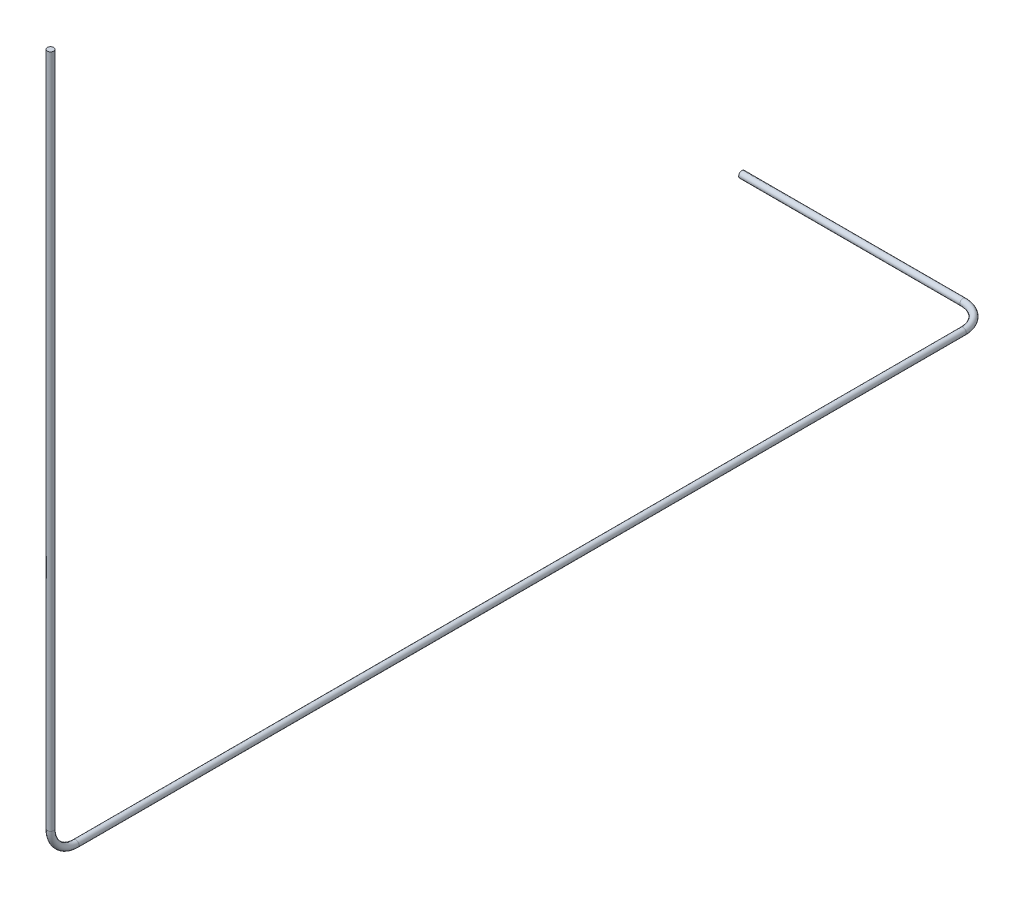
ISO-10303-21;
HEADER;
FILE_DESCRIPTION(('STEP AP214'),'2;1');
FILE_NAME('part.step','',(''),(''),'','','');
FILE_SCHEMA(('AUTOMOTIVE_DESIGN { 1 0 10303 214 1 1 1 1 }'));
ENDSEC;
DATA;
#1=APPLICATION_CONTEXT('core data for automotive mechanical design processes');
#2=APPLICATION_PROTOCOL_DEFINITION('international standard','automotive_design',2000,#1);
#3=PRODUCT_CONTEXT('',#1,'mechanical');
#4=PRODUCT('Part','Part','',(#3));
#5=PRODUCT_RELATED_PRODUCT_CATEGORY('part','',(#4));
#6=PRODUCT_DEFINITION_FORMATION('','',#4);
#7=PRODUCT_DEFINITION_CONTEXT('part definition',#1,'design');
#8=PRODUCT_DEFINITION('design','',#6,#7);
#9=PRODUCT_DEFINITION_SHAPE('','',#8);
#10=(LENGTH_UNIT() NAMED_UNIT(*) SI_UNIT(.MILLI.,.METRE.));
#11=(NAMED_UNIT(*) PLANE_ANGLE_UNIT() SI_UNIT($,.RADIAN.));
#12=(NAMED_UNIT(*) SI_UNIT($,.STERADIAN.) SOLID_ANGLE_UNIT());
#13=UNCERTAINTY_MEASURE_WITH_UNIT(LENGTH_MEASURE(1.E-05),#10,'distance_accuracy_value','');
#14=(GEOMETRIC_REPRESENTATION_CONTEXT(3) GLOBAL_UNCERTAINTY_ASSIGNED_CONTEXT((#13)) GLOBAL_UNIT_ASSIGNED_CONTEXT((#10,
#11,#12)) REPRESENTATION_CONTEXT('',''));
#15=CARTESIAN_POINT('',(0.,0.,0.));
#16=DIRECTION('',(0.,0.,1.));
#17=DIRECTION('',(1.,0.,0.));
#18=AXIS2_PLACEMENT_3D('',#15,#16,#17);
#19=CARTESIAN_POINT('',(99.4627980791776,-956.747632740033,1866.72));
#20=DIRECTION('',(-1.,0.,0.));
#21=DIRECTION('',(0.,0.,-1.));
#22=AXIS2_PLACEMENT_3D('',#19,#20,#21);
#23=PLANE('',#22);
#24=CARTESIAN_POINT('',(99.4627980791776,-956.747632740033,1866.72));
#25=DIRECTION('',(-1.,0.,0.));
#26=DIRECTION('',(0.,0.,-1.));
#27=AXIS2_PLACEMENT_3D('',#24,#25,#26);
#28=CIRCLE('',#27,6.34999999999997);
#29=CARTESIAN_POINT('',(99.4627980791776,-956.747632740033,1860.37));
#30=VERTEX_POINT('',#29);
#31=EDGE_CURVE('E56',#30,#30,#28,.T.);
#32=ORIENTED_EDGE('',*,*,#31,.T.);
#33=EDGE_LOOP('',(#32));
#34=FACE_BOUND('',#33,.T.);
#35=ADVANCED_FACE('F44',(#34),#23,.T.);
#36=CARTESIAN_POINT('',(587.020499739197,428.812094771211,3722.09020372795));
#37=DIRECTION('',(0.,-1.,0.));
#38=DIRECTION('',(1.,0.,0.));
#39=AXIS2_PLACEMENT_3D('',#36,#37,#38);
#40=PLANE('',#39);
#41=CARTESIAN_POINT('',(587.020499739197,428.812094771211,3722.09020372795));
#42=DIRECTION('',(0.,-1.,0.));
#43=DIRECTION('',(1.,0.,0.));
#44=AXIS2_PLACEMENT_3D('',#41,#42,#43);
#45=CIRCLE('',#44,6.34999999999997);
#46=CARTESIAN_POINT('',(593.370499739197,428.812094771211,3722.09020372795));
#47=VERTEX_POINT('',#46);
#48=EDGE_CURVE('E12',#47,#47,#45,.T.);
#49=ORIENTED_EDGE('',*,*,#48,.F.);
#50=EDGE_LOOP('',(#49));
#51=FACE_BOUND('',#50,.T.);
#52=ADVANCED_FACE('F62',(#51),#40,.F.);
#53=CARTESIAN_POINT('',(99.4627980791776,-956.747632740033,1866.72));
#54=DIRECTION('',(1.,0.,0.));
#55=DIRECTION('',(0.,1.,0.));
#56=AXIS2_PLACEMENT_3D('',#53,#54,#55);
#57=CYLINDRICAL_SURFACE('',#56,6.34999999999997);
#58=CARTESIAN_POINT('',(537.020499739178,-956.747632740033,1866.72));
#59=DIRECTION('',(-1.,0.,0.));
#60=DIRECTION('',(0.,0.,-1.));
#61=AXIS2_PLACEMENT_3D('',#58,#59,#60);
#62=CIRCLE('',#61,6.34999999999997);
#63=CARTESIAN_POINT('',(537.020499739178,-956.747632740033,1860.37));
#64=VERTEX_POINT('',#63);
#65=EDGE_CURVE('E96',#64,#64,#62,.T.);
#66=ORIENTED_EDGE('',*,*,#65,.T.);
#67=EDGE_LOOP('',(#66));
#68=FACE_BOUND('',#67,.T.);
#69=ORIENTED_EDGE('',*,*,#31,.F.);
#70=EDGE_LOOP('',(#69));
#71=FACE_BOUND('',#70,.T.);
#72=ADVANCED_FACE('F64',(#68,#71),#57,.T.);
#73=CARTESIAN_POINT('',(537.020499739178,-956.747632740033,1916.72));
#74=DIRECTION('',(0.,-1.,0.));
#75=DIRECTION('',(0.,0.,-1.));
#76=AXIS2_PLACEMENT_3D('',#73,#74,#75);
#77=TOROIDAL_SURFACE('',#76,50.,6.34999999999997);
#78=CARTESIAN_POINT('',(587.020499739178,-956.747632740033,1916.72));
#79=DIRECTION('',(0.,0.,-1.));
#80=DIRECTION('',(1.,0.,0.));
#81=AXIS2_PLACEMENT_3D('',#78,#79,#80);
#82=CIRCLE('',#81,6.34999999999997);
#83=CARTESIAN_POINT('',(593.370499739178,-956.747632740033,1916.72));
#84=VERTEX_POINT('',#83);
#85=EDGE_CURVE('E93',#84,#84,#82,.T.);
#86=CARTESIAN_POINT('',(537.020499739178,-956.747632740033,1916.72));
#87=DIRECTION('',(0.,-1.,0.));
#88=DIRECTION('',(0.,0.,-1.));
#89=AXIS2_PLACEMENT_3D('',#86,#87,#88);
#90=CIRCLE('',#89,56.35);
#91=EDGE_CURVE('',#64,#84,#90,.T.);
#92=ORIENTED_EDGE('',*,*,#65,.F.);
#93=ORIENTED_EDGE('',*,*,#85,.T.);
#94=ORIENTED_EDGE('',*,*,#91,.T.);
#95=ORIENTED_EDGE('',*,*,#91,.F.);
#96=EDGE_LOOP('',(#92,#94,#93,#95));
#97=FACE_BOUND('',#96,.T.);
#98=ADVANCED_FACE('F69',(#97),#77,.T.);
#99=CARTESIAN_POINT('',(587.020499739178,-956.747632740033,1916.72));
#100=DIRECTION('',(0.,0.,1.));
#101=DIRECTION('',(1.,0.,0.));
#102=AXIS2_PLACEMENT_3D('',#99,#100,#101);
#103=CYLINDRICAL_SURFACE('',#102,6.34999999999997);
#104=CARTESIAN_POINT('',(587.020499739178,-956.747632740033,3672.09020372795));
#105=DIRECTION('',(0.,0.,-1.));
#106=DIRECTION('',(1.,0.,0.));
#107=AXIS2_PLACEMENT_3D('',#104,#105,#106);
#108=CIRCLE('',#107,6.34999999999997);
#109=CARTESIAN_POINT('',(587.020499739178,-963.097632740033,3672.09020372795));
#110=VERTEX_POINT('',#109);
#111=EDGE_CURVE('E98',#110,#110,#108,.T.);
#112=ORIENTED_EDGE('',*,*,#111,.T.);
#113=EDGE_LOOP('',(#112));
#114=FACE_BOUND('',#113,.T.);
#115=ORIENTED_EDGE('',*,*,#85,.F.);
#116=EDGE_LOOP('',(#115));
#117=FACE_BOUND('',#116,.T.);
#118=ADVANCED_FACE('F79',(#114,#117),#103,.T.);
#119=CARTESIAN_POINT('',(587.020499739178,-906.747632740033,3672.09020372795));
#120=DIRECTION('',(-1.,0.,0.));
#121=DIRECTION('',(0.,0.,1.));
#122=AXIS2_PLACEMENT_3D('',#119,#120,#121);
#123=TOROIDAL_SURFACE('',#122,50.,6.34999999999997);
#124=CARTESIAN_POINT('',(587.020499739184,-906.747632740041,3722.09020372795));
#125=DIRECTION('',(0.,-1.,0.));
#126=DIRECTION('',(1.,0.,0.));
#127=AXIS2_PLACEMENT_3D('',#124,#125,#126);
#128=CIRCLE('',#127,6.34999999999997);
#129=CARTESIAN_POINT('',(587.020499739185,-906.747632740042,3728.44020372795));
#130=VERTEX_POINT('',#129);
#131=EDGE_CURVE('E51',#130,#130,#128,.T.);
#132=CARTESIAN_POINT('',(587.020499739178,-906.747632740033,3672.09020372795));
#133=DIRECTION('',(-1.,0.,0.));
#134=DIRECTION('',(0.,0.,1.));
#135=AXIS2_PLACEMENT_3D('',#132,#133,#134);
#136=CIRCLE('',#135,56.35);
#137=EDGE_CURVE('',#110,#130,#136,.T.);
#138=ORIENTED_EDGE('',*,*,#111,.F.);
#139=ORIENTED_EDGE('',*,*,#131,.T.);
#140=ORIENTED_EDGE('',*,*,#137,.T.);
#141=ORIENTED_EDGE('',*,*,#137,.F.);
#142=EDGE_LOOP('',(#138,#140,#139,#141));
#143=FACE_BOUND('',#142,.T.);
#144=ADVANCED_FACE('F75',(#143),#123,.T.);
#145=CARTESIAN_POINT('',(587.020499739178,-906.747632740033,3722.09020372795));
#146=DIRECTION('',(0.,1.,0.));
#147=DIRECTION('',(-1.,0.,0.));
#148=AXIS2_PLACEMENT_3D('',#145,#146,#147);
#149=CYLINDRICAL_SURFACE('',#148,6.34999999999997);
#150=ORIENTED_EDGE('',*,*,#48,.T.);
#151=EDGE_LOOP('',(#150));
#152=FACE_BOUND('',#151,.T.);
#153=ORIENTED_EDGE('',*,*,#131,.F.);
#154=EDGE_LOOP('',(#153));
#155=FACE_BOUND('',#154,.T.);
#156=ADVANCED_FACE('F59',(#152,#155),#149,.T.);
#157=CLOSED_SHELL('',(#35,#52,#72,#98,#118,#144,#156));
#158=MANIFOLD_SOLID_BREP('B2',#157);
#159=ADVANCED_BREP_SHAPE_REPRESENTATION('',(#18,#158),#14);
#160=SHAPE_DEFINITION_REPRESENTATION(#9,#159);
ENDSEC;
END-ISO-10303-21;
